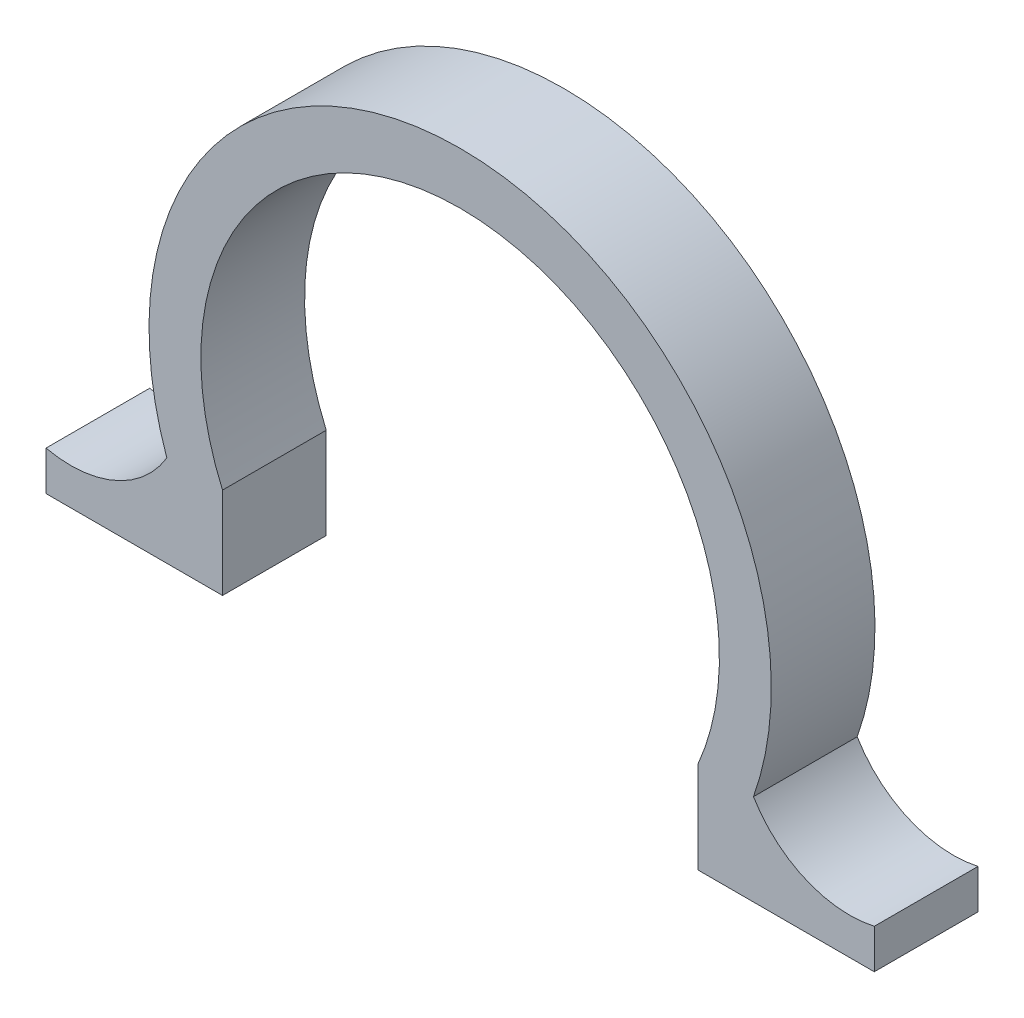
ISO-10303-21;
HEADER;
FILE_DESCRIPTION(('STEP AP214'),'2;1');
FILE_NAME('part.step','',(''),(''),'','','');
FILE_SCHEMA(('AUTOMOTIVE_DESIGN { 1 0 10303 214 1 1 1 1 }'));
ENDSEC;
DATA;
#1=APPLICATION_CONTEXT('core data for automotive mechanical design processes');
#2=APPLICATION_PROTOCOL_DEFINITION('international standard','automotive_design',2000,#1);
#3=PRODUCT_CONTEXT('',#1,'mechanical');
#4=PRODUCT('Part','Part','',(#3));
#5=PRODUCT_RELATED_PRODUCT_CATEGORY('part','',(#4));
#6=PRODUCT_DEFINITION_FORMATION('','',#4);
#7=PRODUCT_DEFINITION_CONTEXT('part definition',#1,'design');
#8=PRODUCT_DEFINITION('design','',#6,#7);
#9=PRODUCT_DEFINITION_SHAPE('','',#8);
#10=(LENGTH_UNIT() NAMED_UNIT(*) SI_UNIT(.MILLI.,.METRE.));
#11=(NAMED_UNIT(*) PLANE_ANGLE_UNIT() SI_UNIT($,.RADIAN.));
#12=(NAMED_UNIT(*) SI_UNIT($,.STERADIAN.) SOLID_ANGLE_UNIT());
#13=UNCERTAINTY_MEASURE_WITH_UNIT(LENGTH_MEASURE(1.E-05),#10,'distance_accuracy_value','');
#14=(GEOMETRIC_REPRESENTATION_CONTEXT(3) GLOBAL_UNCERTAINTY_ASSIGNED_CONTEXT((#13)) GLOBAL_UNIT_ASSIGNED_CONTEXT((#10,
#11,#12)) REPRESENTATION_CONTEXT('',''));
#15=CARTESIAN_POINT('',(0.,0.,0.));
#16=DIRECTION('',(0.,0.,1.));
#17=DIRECTION('',(1.,0.,0.));
#18=AXIS2_PLACEMENT_3D('',#15,#16,#17);
#19=CARTESIAN_POINT('',(0.,0.,12.7));
#20=DIRECTION('',(0.,0.,-1.));
#21=DIRECTION('',(-1.,0.,0.));
#22=AXIS2_PLACEMENT_3D('',#19,#20,#21);
#23=CYLINDRICAL_SURFACE('',#22,38.1);
#24=CARTESIAN_POINT('',(0.,0.,0.));
#25=DIRECTION('',(0.,0.,1.));
#26=DIRECTION('',(1.,0.,0.));
#27=AXIS2_PLACEMENT_3D('',#24,#25,#26);
#28=CIRCLE('',#27,38.1);
#29=CARTESIAN_POINT('',(35.9210244842766,-12.7,0.));
#30=VERTEX_POINT('',#29);
#31=CARTESIAN_POINT('',(-35.9210244842766,-12.7,0.));
#32=VERTEX_POINT('',#31);
#33=EDGE_CURVE('E59',#30,#32,#28,.T.);
#34=ORIENTED_EDGE('',*,*,#33,.T.);
#35=DIRECTION('',(0.,0.,-1.));
#36=VECTOR('',#35,1.);
#37=CARTESIAN_POINT('',(-35.9210244842766,-12.7,12.7));
#38=LINE('',#37,#36);
#39=CARTESIAN_POINT('',(-35.9210244842766,-12.7,12.7));
#40=VERTEX_POINT('',#39);
#41=EDGE_CURVE('E11',#40,#32,#38,.T.);
#42=ORIENTED_EDGE('',*,*,#41,.F.);
#43=CARTESIAN_POINT('',(0.,0.,12.7));
#44=DIRECTION('',(0.,0.,1.));
#45=DIRECTION('',(1.,0.,0.));
#46=AXIS2_PLACEMENT_3D('',#43,#44,#45);
#47=CIRCLE('',#46,38.1);
#48=CARTESIAN_POINT('',(35.9210244842766,-12.7,12.7));
#49=VERTEX_POINT('',#48);
#50=EDGE_CURVE('E49',#49,#40,#47,.T.);
#51=ORIENTED_EDGE('',*,*,#50,.F.);
#52=DIRECTION('',(0.,0.,-1.));
#53=VECTOR('',#52,1.);
#54=CARTESIAN_POINT('',(35.9210244842766,-12.7,12.7));
#55=LINE('',#54,#53);
#56=EDGE_CURVE('E101',#49,#30,#55,.T.);
#57=ORIENTED_EDGE('',*,*,#56,.T.);
#58=EDGE_LOOP('',(#34,#42,#51,#57));
#59=FACE_BOUND('',#58,.T.);
#60=ADVANCED_FACE('F33',(#59),#23,.T.);
#61=CARTESIAN_POINT('',(0.,0.,12.7));
#62=DIRECTION('',(0.,0.,-1.));
#63=DIRECTION('',(-1.,0.,0.));
#64=AXIS2_PLACEMENT_3D('',#61,#62,#63);
#65=CYLINDRICAL_SURFACE('',#64,31.75);
#66=CARTESIAN_POINT('',(0.,0.,0.));
#67=DIRECTION('',(0.,0.,-1.));
#68=DIRECTION('',(1.,0.,0.));
#69=AXIS2_PLACEMENT_3D('',#66,#67,#68);
#70=CIRCLE('',#69,31.75);
#71=CARTESIAN_POINT('',(-29.0993556629696,-12.7,0.));
#72=VERTEX_POINT('',#71);
#73=CARTESIAN_POINT('',(29.0993556629696,-12.7,0.));
#74=VERTEX_POINT('',#73);
#75=EDGE_CURVE('E170',#72,#74,#70,.T.);
#76=ORIENTED_EDGE('',*,*,#75,.T.);
#77=DIRECTION('',(0.,0.,-1.));
#78=VECTOR('',#77,1.);
#79=CARTESIAN_POINT('',(29.0993556629696,-12.7,12.7));
#80=LINE('',#79,#78);
#81=CARTESIAN_POINT('',(29.0993556629696,-12.7,12.7));
#82=VERTEX_POINT('',#81);
#83=EDGE_CURVE('E97',#82,#74,#80,.T.);
#84=ORIENTED_EDGE('',*,*,#83,.F.);
#85=CARTESIAN_POINT('',(0.,0.,12.7));
#86=DIRECTION('',(0.,0.,-1.));
#87=DIRECTION('',(1.,0.,0.));
#88=AXIS2_PLACEMENT_3D('',#85,#86,#87);
#89=CIRCLE('',#88,31.75);
#90=CARTESIAN_POINT('',(-29.0993556629696,-12.7,12.7));
#91=VERTEX_POINT('',#90);
#92=EDGE_CURVE('E91',#91,#82,#89,.T.);
#93=ORIENTED_EDGE('',*,*,#92,.F.);
#94=DIRECTION('',(0.,0.,-1.));
#95=VECTOR('',#94,1.);
#96=CARTESIAN_POINT('',(-29.0993556629696,-12.7,12.7));
#97=LINE('',#96,#95);
#98=EDGE_CURVE('E41',#91,#72,#97,.T.);
#99=ORIENTED_EDGE('',*,*,#98,.T.);
#100=EDGE_LOOP('',(#76,#84,#93,#99));
#101=FACE_BOUND('',#100,.T.);
#102=ADVANCED_FACE('F93',(#101),#65,.F.);
#103=CARTESIAN_POINT('',(0.,0.,12.7));
#104=DIRECTION('',(0.,0.,1.));
#105=DIRECTION('',(1.,0.,0.));
#106=AXIS2_PLACEMENT_3D('',#103,#104,#105);
#107=PLANE('',#106);
#108=ORIENTED_EDGE('',*,*,#50,.T.);
#109=CARTESIAN_POINT('',(-47.6983291251957,-5.66979720100576,12.7));
#110=DIRECTION('',(0.,0.,1.));
#111=DIRECTION('',(1.,0.,0.));
#112=AXIS2_PLACEMENT_3D('',#109,#110,#111);
#113=CIRCLE('',#112,13.716);
#114=CARTESIAN_POINT('',(-50.7147556629696,-19.05,12.7));
#115=VERTEX_POINT('',#114);
#116=EDGE_CURVE('E126',#115,#40,#113,.T.);
#117=ORIENTED_EDGE('',*,*,#116,.F.);
#118=DIRECTION('',(0.,1.,0.));
#119=VECTOR('',#118,1.);
#120=CARTESIAN_POINT('',(-50.7147556629696,-23.876,12.7));
#121=LINE('',#120,#119);
#122=CARTESIAN_POINT('',(-50.7147556629696,-23.876,12.7));
#123=VERTEX_POINT('',#122);
#124=EDGE_CURVE('E118',#123,#115,#121,.T.);
#125=ORIENTED_EDGE('',*,*,#124,.F.);
#126=DIRECTION('',(-1.,0.,0.));
#127=VECTOR('',#126,1.);
#128=CARTESIAN_POINT('',(-29.0993556629696,-23.876,12.7));
#129=LINE('',#128,#127);
#130=CARTESIAN_POINT('',(-29.0993556629696,-23.876,12.7));
#131=VERTEX_POINT('',#130);
#132=EDGE_CURVE('E115',#131,#123,#129,.T.);
#133=ORIENTED_EDGE('',*,*,#132,.F.);
#134=DIRECTION('',(0.,-1.,0.));
#135=VECTOR('',#134,1.);
#136=CARTESIAN_POINT('',(-29.0993556629696,-12.7,12.7));
#137=LINE('',#136,#135);
#138=EDGE_CURVE('E108',#91,#131,#137,.T.);
#139=ORIENTED_EDGE('',*,*,#138,.F.);
#140=ORIENTED_EDGE('',*,*,#92,.T.);
#141=DIRECTION('',(0.,1.,0.));
#142=VECTOR('',#141,1.);
#143=CARTESIAN_POINT('',(29.0993556629696,-12.7,12.7));
#144=LINE('',#143,#142);
#145=CARTESIAN_POINT('',(29.0993556629696,-23.876,12.7));
#146=VERTEX_POINT('',#145);
#147=EDGE_CURVE('E153',#146,#82,#144,.T.);
#148=ORIENTED_EDGE('',*,*,#147,.F.);
#149=DIRECTION('',(-1.,0.,0.));
#150=VECTOR('',#149,1.);
#151=CARTESIAN_POINT('',(29.0993556629696,-23.876,12.7));
#152=LINE('',#151,#150);
#153=CARTESIAN_POINT('',(50.7147556629696,-23.876,12.7));
#154=VERTEX_POINT('',#153);
#155=EDGE_CURVE('E151',#154,#146,#152,.T.);
#156=ORIENTED_EDGE('',*,*,#155,.F.);
#157=DIRECTION('',(0.,-1.,0.));
#158=VECTOR('',#157,1.);
#159=CARTESIAN_POINT('',(50.7147556629696,-23.876,12.7));
#160=LINE('',#159,#158);
#161=CARTESIAN_POINT('',(50.7147556629696,-19.05,12.7));
#162=VERTEX_POINT('',#161);
#163=EDGE_CURVE('E147',#162,#154,#160,.T.);
#164=ORIENTED_EDGE('',*,*,#163,.F.);
#165=CARTESIAN_POINT('',(47.6983291251957,-5.66979720100576,12.7));
#166=DIRECTION('',(0.,0.,1.));
#167=DIRECTION('',(-1.,0.,0.));
#168=AXIS2_PLACEMENT_3D('',#165,#166,#167);
#169=CIRCLE('',#168,13.716);
#170=EDGE_CURVE('E144',#49,#162,#169,.T.);
#171=ORIENTED_EDGE('',*,*,#170,.F.);
#172=EDGE_LOOP('',(#108,#117,#125,#133,#139,#140,#148,#156,#164,#171));
#173=FACE_BOUND('',#172,.T.);
#174=ADVANCED_FACE('F112',(#173),#107,.T.);
#175=CARTESIAN_POINT('',(0.,0.,0.));
#176=DIRECTION('',(0.,0.,1.));
#177=DIRECTION('',(1.,0.,0.));
#178=AXIS2_PLACEMENT_3D('',#175,#176,#177);
#179=PLANE('',#178);
#180=ORIENTED_EDGE('',*,*,#33,.F.);
#181=CARTESIAN_POINT('',(47.6983291251957,-5.66979720100576,0.));
#182=DIRECTION('',(0.,0.,1.));
#183=DIRECTION('',(-1.,0.,0.));
#184=AXIS2_PLACEMENT_3D('',#181,#182,#183);
#185=CIRCLE('',#184,13.716);
#186=CARTESIAN_POINT('',(50.7147556629696,-19.05,0.));
#187=VERTEX_POINT('',#186);
#188=EDGE_CURVE('E139',#30,#187,#185,.T.);
#189=ORIENTED_EDGE('',*,*,#188,.T.);
#190=DIRECTION('',(0.,-1.,0.));
#191=VECTOR('',#190,1.);
#192=CARTESIAN_POINT('',(50.7147556629696,-23.876,0.));
#193=LINE('',#192,#191);
#194=CARTESIAN_POINT('',(50.7147556629696,-23.876,0.));
#195=VERTEX_POINT('',#194);
#196=EDGE_CURVE('E158',#187,#195,#193,.T.);
#197=ORIENTED_EDGE('',*,*,#196,.T.);
#198=DIRECTION('',(-1.,0.,0.));
#199=VECTOR('',#198,1.);
#200=CARTESIAN_POINT('',(29.0993556629696,-23.876,0.));
#201=LINE('',#200,#199);
#202=CARTESIAN_POINT('',(29.0993556629696,-23.876,0.));
#203=VERTEX_POINT('',#202);
#204=EDGE_CURVE('E161',#195,#203,#201,.T.);
#205=ORIENTED_EDGE('',*,*,#204,.T.);
#206=DIRECTION('',(0.,1.,0.));
#207=VECTOR('',#206,1.);
#208=CARTESIAN_POINT('',(29.0993556629696,-12.7,0.));
#209=LINE('',#208,#207);
#210=EDGE_CURVE('E148',#203,#74,#209,.T.);
#211=ORIENTED_EDGE('',*,*,#210,.T.);
#212=ORIENTED_EDGE('',*,*,#75,.F.);
#213=DIRECTION('',(0.,-1.,0.));
#214=VECTOR('',#213,1.);
#215=CARTESIAN_POINT('',(-29.0993556629696,-12.7,0.));
#216=LINE('',#215,#214);
#217=CARTESIAN_POINT('',(-29.0993556629696,-23.876,0.));
#218=VERTEX_POINT('',#217);
#219=EDGE_CURVE('E110',#72,#218,#216,.T.);
#220=ORIENTED_EDGE('',*,*,#219,.T.);
#221=DIRECTION('',(-1.,0.,0.));
#222=VECTOR('',#221,1.);
#223=CARTESIAN_POINT('',(-29.0993556629696,-23.876,0.));
#224=LINE('',#223,#222);
#225=CARTESIAN_POINT('',(-50.7147556629696,-23.876,0.));
#226=VERTEX_POINT('',#225);
#227=EDGE_CURVE('E131',#218,#226,#224,.T.);
#228=ORIENTED_EDGE('',*,*,#227,.T.);
#229=DIRECTION('',(0.,1.,0.));
#230=VECTOR('',#229,1.);
#231=CARTESIAN_POINT('',(-50.7147556629696,-23.876,0.));
#232=LINE('',#231,#230);
#233=CARTESIAN_POINT('',(-50.7147556629696,-19.05,0.));
#234=VERTEX_POINT('',#233);
#235=EDGE_CURVE('E121',#226,#234,#232,.T.);
#236=ORIENTED_EDGE('',*,*,#235,.T.);
#237=CARTESIAN_POINT('',(-47.6983291251957,-5.66979720100576,0.));
#238=DIRECTION('',(0.,0.,1.));
#239=DIRECTION('',(1.,0.,0.));
#240=AXIS2_PLACEMENT_3D('',#237,#238,#239);
#241=CIRCLE('',#240,13.716);
#242=EDGE_CURVE('E116',#234,#32,#241,.T.);
#243=ORIENTED_EDGE('',*,*,#242,.T.);
#244=EDGE_LOOP('',(#180,#189,#197,#205,#211,#212,#220,#228,#236,#243));
#245=FACE_BOUND('',#244,.T.);
#246=ADVANCED_FACE('F178',(#245),#179,.F.);
#247=CARTESIAN_POINT('',(29.0993556629696,-12.7,12.7));
#248=DIRECTION('',(-1.,0.,0.));
#249=DIRECTION('',(0.,-1.,0.));
#250=AXIS2_PLACEMENT_3D('',#247,#248,#249);
#251=PLANE('',#250);
#252=ORIENTED_EDGE('',*,*,#210,.F.);
#253=DIRECTION('',(0.,0.,-1.));
#254=VECTOR('',#253,1.);
#255=CARTESIAN_POINT('',(29.0993556629696,-23.876,12.7));
#256=LINE('',#255,#254);
#257=EDGE_CURVE('E69',#146,#203,#256,.T.);
#258=ORIENTED_EDGE('',*,*,#257,.F.);
#259=ORIENTED_EDGE('',*,*,#147,.T.);
#260=ORIENTED_EDGE('',*,*,#83,.T.);
#261=EDGE_LOOP('',(#252,#258,#259,#260));
#262=FACE_BOUND('',#261,.T.);
#263=ADVANCED_FACE('F175',(#262),#251,.T.);
#264=CARTESIAN_POINT('',(29.0993556629696,-23.876,12.7));
#265=DIRECTION('',(0.,-1.,0.));
#266=DIRECTION('',(0.,0.,-1.));
#267=AXIS2_PLACEMENT_3D('',#264,#265,#266);
#268=PLANE('',#267);
#269=ORIENTED_EDGE('',*,*,#204,.F.);
#270=DIRECTION('',(0.,0.,-1.));
#271=VECTOR('',#270,1.);
#272=CARTESIAN_POINT('',(50.7147556629696,-23.876,12.7));
#273=LINE('',#272,#271);
#274=EDGE_CURVE('E167',#154,#195,#273,.T.);
#275=ORIENTED_EDGE('',*,*,#274,.F.);
#276=ORIENTED_EDGE('',*,*,#155,.T.);
#277=ORIENTED_EDGE('',*,*,#257,.T.);
#278=EDGE_LOOP('',(#269,#275,#276,#277));
#279=FACE_BOUND('',#278,.T.);
#280=ADVANCED_FACE('F182',(#279),#268,.T.);
#281=CARTESIAN_POINT('',(50.7147556629696,-23.876,12.7));
#282=DIRECTION('',(1.,0.,0.));
#283=DIRECTION('',(0.,0.,-1.));
#284=AXIS2_PLACEMENT_3D('',#281,#282,#283);
#285=PLANE('',#284);
#286=ORIENTED_EDGE('',*,*,#196,.F.);
#287=DIRECTION('',(0.,0.,-1.));
#288=VECTOR('',#287,1.);
#289=CARTESIAN_POINT('',(50.7147556629696,-19.05,12.7));
#290=LINE('',#289,#288);
#291=EDGE_CURVE('E155',#162,#187,#290,.T.);
#292=ORIENTED_EDGE('',*,*,#291,.F.);
#293=ORIENTED_EDGE('',*,*,#163,.T.);
#294=ORIENTED_EDGE('',*,*,#274,.T.);
#295=EDGE_LOOP('',(#286,#292,#293,#294));
#296=FACE_BOUND('',#295,.T.);
#297=ADVANCED_FACE('F188',(#296),#285,.T.);
#298=CARTESIAN_POINT('',(47.6983291251957,-5.66979720100576,12.7));
#299=DIRECTION('',(0.,0.,-1.));
#300=DIRECTION('',(-1.,0.,0.));
#301=AXIS2_PLACEMENT_3D('',#298,#299,#300);
#302=CYLINDRICAL_SURFACE('',#301,13.716);
#303=ORIENTED_EDGE('',*,*,#188,.F.);
#304=ORIENTED_EDGE('',*,*,#56,.F.);
#305=ORIENTED_EDGE('',*,*,#170,.T.);
#306=ORIENTED_EDGE('',*,*,#291,.T.);
#307=EDGE_LOOP('',(#303,#304,#305,#306));
#308=FACE_BOUND('',#307,.T.);
#309=ADVANCED_FACE('F191',(#308),#302,.F.);
#310=CARTESIAN_POINT('',(-47.6983291251957,-5.66979720100576,12.7));
#311=DIRECTION('',(0.,0.,-1.));
#312=DIRECTION('',(-1.,0.,0.));
#313=AXIS2_PLACEMENT_3D('',#310,#311,#312);
#314=CYLINDRICAL_SURFACE('',#313,13.716);
#315=ORIENTED_EDGE('',*,*,#242,.F.);
#316=DIRECTION('',(0.,0.,-1.));
#317=VECTOR('',#316,1.);
#318=CARTESIAN_POINT('',(-50.7147556629696,-19.05,12.7));
#319=LINE('',#318,#317);
#320=EDGE_CURVE('E136',#115,#234,#319,.T.);
#321=ORIENTED_EDGE('',*,*,#320,.F.);
#322=ORIENTED_EDGE('',*,*,#116,.T.);
#323=ORIENTED_EDGE('',*,*,#41,.T.);
#324=EDGE_LOOP('',(#315,#321,#322,#323));
#325=FACE_BOUND('',#324,.T.);
#326=ADVANCED_FACE('F196',(#325),#314,.F.);
#327=CARTESIAN_POINT('',(-50.7147556629696,-23.876,12.7));
#328=DIRECTION('',(-1.,0.,0.));
#329=DIRECTION('',(0.,0.,1.));
#330=AXIS2_PLACEMENT_3D('',#327,#328,#329);
#331=PLANE('',#330);
#332=ORIENTED_EDGE('',*,*,#235,.F.);
#333=DIRECTION('',(0.,0.,-1.));
#334=VECTOR('',#333,1.);
#335=CARTESIAN_POINT('',(-50.7147556629696,-23.876,12.7));
#336=LINE('',#335,#334);
#337=EDGE_CURVE('E140',#123,#226,#336,.T.);
#338=ORIENTED_EDGE('',*,*,#337,.F.);
#339=ORIENTED_EDGE('',*,*,#124,.T.);
#340=ORIENTED_EDGE('',*,*,#320,.T.);
#341=EDGE_LOOP('',(#332,#338,#339,#340));
#342=FACE_BOUND('',#341,.T.);
#343=ADVANCED_FACE('F203',(#342),#331,.T.);
#344=CARTESIAN_POINT('',(-29.0993556629696,-23.876,12.7));
#345=DIRECTION('',(0.,-1.,0.));
#346=DIRECTION('',(0.,0.,-1.));
#347=AXIS2_PLACEMENT_3D('',#344,#345,#346);
#348=PLANE('',#347);
#349=ORIENTED_EDGE('',*,*,#227,.F.);
#350=DIRECTION('',(0.,0.,-1.));
#351=VECTOR('',#350,1.);
#352=CARTESIAN_POINT('',(-29.0993556629696,-23.876,12.7));
#353=LINE('',#352,#351);
#354=EDGE_CURVE('E129',#131,#218,#353,.T.);
#355=ORIENTED_EDGE('',*,*,#354,.F.);
#356=ORIENTED_EDGE('',*,*,#132,.T.);
#357=ORIENTED_EDGE('',*,*,#337,.T.);
#358=EDGE_LOOP('',(#349,#355,#356,#357));
#359=FACE_BOUND('',#358,.T.);
#360=ADVANCED_FACE('F208',(#359),#348,.T.);
#361=CARTESIAN_POINT('',(-29.0993556629696,-12.7,12.7));
#362=DIRECTION('',(1.,0.,0.));
#363=DIRECTION('',(0.,0.,-1.));
#364=AXIS2_PLACEMENT_3D('',#361,#362,#363);
#365=PLANE('',#364);
#366=ORIENTED_EDGE('',*,*,#219,.F.);
#367=ORIENTED_EDGE('',*,*,#98,.F.);
#368=ORIENTED_EDGE('',*,*,#138,.T.);
#369=ORIENTED_EDGE('',*,*,#354,.T.);
#370=EDGE_LOOP('',(#366,#367,#368,#369));
#371=FACE_BOUND('',#370,.T.);
#372=ADVANCED_FACE('F105',(#371),#365,.T.);
#373=CLOSED_SHELL('',(#60,#102,#174,#246,#263,#280,#297,#309,#326,#343,#360,#372));
#374=MANIFOLD_SOLID_BREP('B2',#373);
#375=ADVANCED_BREP_SHAPE_REPRESENTATION('',(#18,#374),#14);
#376=SHAPE_DEFINITION_REPRESENTATION(#9,#375);
ENDSEC;
END-ISO-10303-21;
